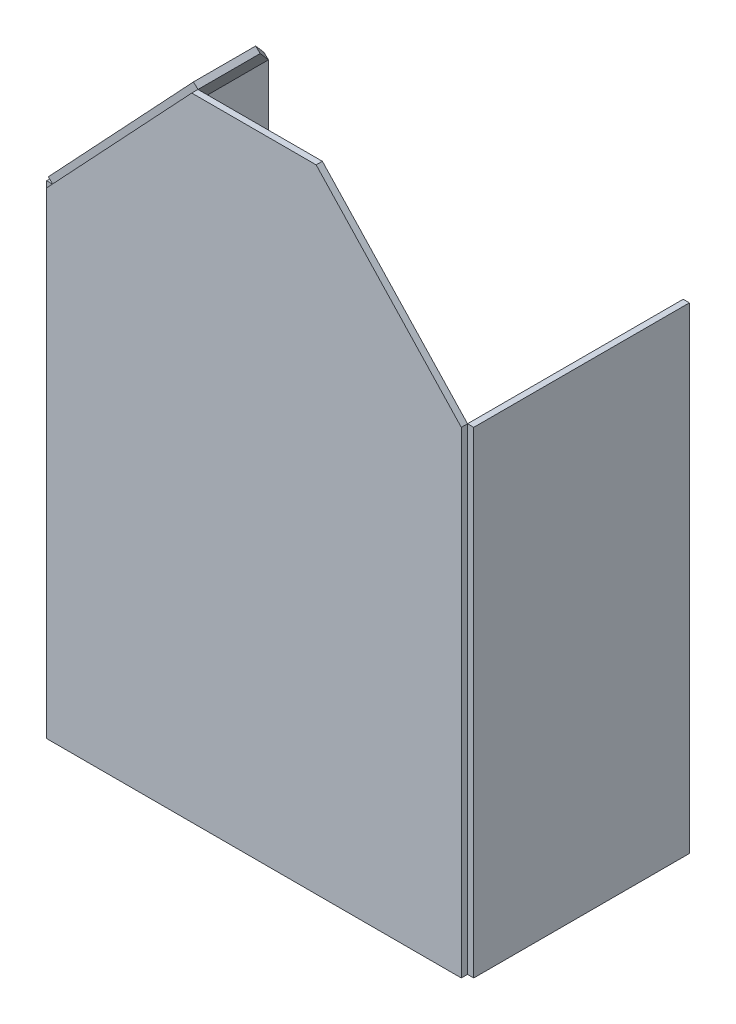
ISO-10303-21;
HEADER;
FILE_DESCRIPTION(('STEP AP214'),'2;1');
FILE_NAME('part.step','',(''),(''),'','','');
FILE_SCHEMA(('AUTOMOTIVE_DESIGN { 1 0 10303 214 1 1 1 1 }'));
ENDSEC;
DATA;
#1=APPLICATION_CONTEXT('core data for automotive mechanical design processes');
#2=APPLICATION_PROTOCOL_DEFINITION('international standard','automotive_design',2000,#1);
#3=PRODUCT_CONTEXT('',#1,'mechanical');
#4=PRODUCT('Part','Part','',(#3));
#5=PRODUCT_RELATED_PRODUCT_CATEGORY('part','',(#4));
#6=PRODUCT_DEFINITION_FORMATION('','',#4);
#7=PRODUCT_DEFINITION_CONTEXT('part definition',#1,'design');
#8=PRODUCT_DEFINITION('design','',#6,#7);
#9=PRODUCT_DEFINITION_SHAPE('','',#8);
#10=(LENGTH_UNIT() NAMED_UNIT(*) SI_UNIT(.MILLI.,.METRE.));
#11=(NAMED_UNIT(*) PLANE_ANGLE_UNIT() SI_UNIT($,.RADIAN.));
#12=(NAMED_UNIT(*) SI_UNIT($,.STERADIAN.) SOLID_ANGLE_UNIT());
#13=UNCERTAINTY_MEASURE_WITH_UNIT(LENGTH_MEASURE(1.E-05),#10,'distance_accuracy_value','');
#14=(GEOMETRIC_REPRESENTATION_CONTEXT(3) GLOBAL_UNCERTAINTY_ASSIGNED_CONTEXT((#13)) GLOBAL_UNIT_ASSIGNED_CONTEXT((#10,
#11,#12)) REPRESENTATION_CONTEXT('',''));
#15=CARTESIAN_POINT('',(0.,0.,0.));
#16=DIRECTION('',(0.,0.,1.));
#17=DIRECTION('',(1.,0.,0.));
#18=AXIS2_PLACEMENT_3D('',#15,#16,#17);
#19=CARTESIAN_POINT('',(-3.,230.,-104.));
#20=DIRECTION('',(0.,0.,-1.));
#21=DIRECTION('',(0.,1.,0.));
#22=AXIS2_PLACEMENT_3D('',#19,#20,#21);
#23=PLANE('',#22);
#24=DIRECTION('',(0.,1.,0.));
#25=VECTOR('',#24,1.);
#26=CARTESIAN_POINT('',(0.,230.,-104.));
#27=LINE('',#26,#25);
#28=CARTESIAN_POINT('',(0.,-0.0864023309644507,-104.));
#29=VERTEX_POINT('',#28);
#30=CARTESIAN_POINT('',(0.,230.,-104.));
#31=VERTEX_POINT('',#30);
#32=EDGE_CURVE('E108',#29,#31,#27,.T.);
#33=ORIENTED_EDGE('',*,*,#32,.F.);
#34=DIRECTION('',(1.,0.,0.));
#35=VECTOR('',#34,1.);
#36=CARTESIAN_POINT('',(-3.,-0.0864023309644507,-104.));
#37=LINE('',#36,#35);
#38=CARTESIAN_POINT('',(-3.,-0.0864023309644507,-104.));
#39=VERTEX_POINT('',#38);
#40=EDGE_CURVE('E12',#39,#29,#37,.T.);
#41=ORIENTED_EDGE('',*,*,#40,.F.);
#42=DIRECTION('',(0.,1.,0.));
#43=VECTOR('',#42,1.);
#44=CARTESIAN_POINT('',(-3.,230.,-104.));
#45=LINE('',#44,#43);
#46=CARTESIAN_POINT('',(-3.,230.,-104.));
#47=VERTEX_POINT('',#46);
#48=EDGE_CURVE('E102',#39,#47,#45,.T.);
#49=ORIENTED_EDGE('',*,*,#48,.T.);
#50=DIRECTION('',(1.,0.,0.));
#51=VECTOR('',#50,1.);
#52=CARTESIAN_POINT('',(-3.,230.,-104.));
#53=LINE('',#52,#51);
#54=EDGE_CURVE('E47',#47,#31,#53,.T.);
#55=ORIENTED_EDGE('',*,*,#54,.T.);
#56=EDGE_LOOP('',(#33,#41,#49,#55));
#57=FACE_BOUND('',#56,.T.);
#58=ADVANCED_FACE('F44',(#57),#23,.T.);
#59=CARTESIAN_POINT('',(-3.,-0.0864023309644507,-104.));
#60=DIRECTION('',(0.,-1.,0.));
#61=DIRECTION('',(0.,0.,-1.));
#62=AXIS2_PLACEMENT_3D('',#59,#60,#61);
#63=PLANE('',#62);
#64=DIRECTION('',(0.,0.,-1.));
#65=VECTOR('',#64,1.);
#66=CARTESIAN_POINT('',(0.,-0.0864023309644507,-104.));
#67=LINE('',#66,#65);
#68=CARTESIAN_POINT('',(0.,-0.0864023309644635,-1.41915123067224E-13));
#69=VERTEX_POINT('',#68);
#70=EDGE_CURVE('E104',#69,#29,#67,.T.);
#71=ORIENTED_EDGE('',*,*,#70,.F.);
#72=DIRECTION('',(1.,0.,0.));
#73=VECTOR('',#72,1.);
#74=CARTESIAN_POINT('',(-3.,-0.0864023309644635,-1.41915123067224E-13));
#75=LINE('',#74,#73);
#76=CARTESIAN_POINT('',(-3.,-0.0864023309644635,-1.41915123067224E-13));
#77=VERTEX_POINT('',#76);
#78=EDGE_CURVE('E53',#77,#69,#75,.T.);
#79=ORIENTED_EDGE('',*,*,#78,.F.);
#80=DIRECTION('',(0.,0.,-1.));
#81=VECTOR('',#80,1.);
#82=CARTESIAN_POINT('',(-3.,-0.0864023309644507,-104.));
#83=LINE('',#82,#81);
#84=EDGE_CURVE('E99',#77,#39,#83,.T.);
#85=ORIENTED_EDGE('',*,*,#84,.T.);
#86=ORIENTED_EDGE('',*,*,#40,.T.);
#87=EDGE_LOOP('',(#71,#79,#85,#86));
#88=FACE_BOUND('',#87,.T.);
#89=ADVANCED_FACE('F118',(#88),#63,.T.);
#90=CARTESIAN_POINT('',(-3.,230.,0.));
#91=DIRECTION('',(0.,0.,1.));
#92=DIRECTION('',(0.,-1.,0.));
#93=AXIS2_PLACEMENT_3D('',#90,#91,#92);
#94=PLANE('',#93);
#95=DIRECTION('',(0.,-1.,0.));
#96=VECTOR('',#95,1.);
#97=CARTESIAN_POINT('',(0.,230.,0.));
#98=LINE('',#97,#96);
#99=CARTESIAN_POINT('',(0.,230.,0.));
#100=VERTEX_POINT('',#99);
#101=EDGE_CURVE('E94',#100,#69,#98,.T.);
#102=ORIENTED_EDGE('',*,*,#101,.F.);
#103=DIRECTION('',(1.,0.,0.));
#104=VECTOR('',#103,1.);
#105=CARTESIAN_POINT('',(-3.,230.,0.));
#106=LINE('',#105,#104);
#107=CARTESIAN_POINT('',(-3.,230.,0.));
#108=VERTEX_POINT('',#107);
#109=EDGE_CURVE('E89',#108,#100,#106,.T.);
#110=ORIENTED_EDGE('',*,*,#109,.F.);
#111=DIRECTION('',(0.,-1.,0.));
#112=VECTOR('',#111,1.);
#113=CARTESIAN_POINT('',(-3.,230.,0.));
#114=LINE('',#113,#112);
#115=EDGE_CURVE('E92',#108,#77,#114,.T.);
#116=ORIENTED_EDGE('',*,*,#115,.T.);
#117=ORIENTED_EDGE('',*,*,#78,.T.);
#118=EDGE_LOOP('',(#102,#110,#116,#117));
#119=FACE_BOUND('',#118,.T.);
#120=ADVANCED_FACE('F91',(#119),#94,.T.);
#121=CARTESIAN_POINT('',(-3.,230.,-104.));
#122=DIRECTION('',(0.,1.,0.));
#123=DIRECTION('',(0.,0.,1.));
#124=AXIS2_PLACEMENT_3D('',#121,#122,#123);
#125=PLANE('',#124);
#126=DIRECTION('',(0.,0.,1.));
#127=VECTOR('',#126,1.);
#128=CARTESIAN_POINT('',(0.,230.,-104.));
#129=LINE('',#128,#127);
#130=EDGE_CURVE('E111',#31,#100,#129,.T.);
#131=ORIENTED_EDGE('',*,*,#130,.F.);
#132=ORIENTED_EDGE('',*,*,#54,.F.);
#133=DIRECTION('',(0.,0.,1.));
#134=VECTOR('',#133,1.);
#135=CARTESIAN_POINT('',(-3.,230.,-104.));
#136=LINE('',#135,#134);
#137=EDGE_CURVE('E98',#47,#108,#136,.T.);
#138=ORIENTED_EDGE('',*,*,#137,.T.);
#139=ORIENTED_EDGE('',*,*,#109,.T.);
#140=EDGE_LOOP('',(#131,#132,#138,#139));
#141=FACE_BOUND('',#140,.T.);
#142=ADVANCED_FACE('F101',(#141),#125,.T.);
#143=CARTESIAN_POINT('',(-3.,0.,0.));
#144=DIRECTION('',(-1.,0.,0.));
#145=DIRECTION('',(0.,0.,1.));
#146=AXIS2_PLACEMENT_3D('',#143,#144,#145);
#147=PLANE('',#146);
#148=ORIENTED_EDGE('',*,*,#48,.F.);
#149=ORIENTED_EDGE('',*,*,#84,.F.);
#150=ORIENTED_EDGE('',*,*,#115,.F.);
#151=ORIENTED_EDGE('',*,*,#137,.F.);
#152=EDGE_LOOP('',(#148,#149,#150,#151));
#153=FACE_BOUND('',#152,.T.);
#154=ADVANCED_FACE('F97',(#153),#147,.T.);
#155=CARTESIAN_POINT('',(0.,0.,0.));
#156=DIRECTION('',(-1.,0.,0.));
#157=DIRECTION('',(0.,0.,1.));
#158=AXIS2_PLACEMENT_3D('',#155,#156,#157);
#159=PLANE('',#158);
#160=ORIENTED_EDGE('',*,*,#32,.T.);
#161=ORIENTED_EDGE('',*,*,#130,.T.);
#162=ORIENTED_EDGE('',*,*,#101,.T.);
#163=ORIENTED_EDGE('',*,*,#70,.T.);
#164=EDGE_LOOP('',(#160,#161,#162,#163));
#165=FACE_BOUND('',#164,.T.);
#166=ADVANCED_FACE('F117',(#165),#159,.F.);
#167=CLOSED_SHELL('',(#58,#89,#120,#142,#154,#166));
#168=MANIFOLD_SOLID_BREP('B2',#167);
#169=CARTESIAN_POINT('',(203.,230.,0.));
#170=DIRECTION('',(0.,-1.,0.));
#171=DIRECTION('',(0.,0.,-1.));
#172=AXIS2_PLACEMENT_3D('',#169,#170,#171);
#173=PLANE('',#172);
#174=DIRECTION('',(0.,0.,1.));
#175=VECTOR('',#174,1.);
#176=CARTESIAN_POINT('',(200.,230.,0.));
#177=LINE('',#176,#175);
#178=CARTESIAN_POINT('',(200.,230.,-104.));
#179=VERTEX_POINT('',#178);
#180=CARTESIAN_POINT('',(200.,230.,0.));
#181=VERTEX_POINT('',#180);
#182=EDGE_CURVE('E241',#179,#181,#177,.T.);
#183=ORIENTED_EDGE('',*,*,#182,.T.);
#184=DIRECTION('',(-1.,0.,0.));
#185=VECTOR('',#184,1.);
#186=CARTESIAN_POINT('',(203.,230.,0.));
#187=LINE('',#186,#185);
#188=CARTESIAN_POINT('',(203.,230.,0.));
#189=VERTEX_POINT('',#188);
#190=EDGE_CURVE('E42',#189,#181,#187,.T.);
#191=ORIENTED_EDGE('',*,*,#190,.F.);
#192=DIRECTION('',(0.,0.,1.));
#193=VECTOR('',#192,1.);
#194=CARTESIAN_POINT('',(203.,230.,0.));
#195=LINE('',#194,#193);
#196=CARTESIAN_POINT('',(203.,230.,-104.));
#197=VERTEX_POINT('',#196);
#198=EDGE_CURVE('E229',#197,#189,#195,.T.);
#199=ORIENTED_EDGE('',*,*,#198,.F.);
#200=DIRECTION('',(-1.,0.,0.));
#201=VECTOR('',#200,1.);
#202=CARTESIAN_POINT('',(203.,230.,-104.));
#203=LINE('',#202,#201);
#204=EDGE_CURVE('E237',#197,#179,#203,.T.);
#205=ORIENTED_EDGE('',*,*,#204,.T.);
#206=EDGE_LOOP('',(#183,#191,#199,#205));
#207=FACE_BOUND('',#206,.T.);
#208=ADVANCED_FACE('F178',(#207),#173,.F.);
#209=CARTESIAN_POINT('',(203.,230.,0.));
#210=DIRECTION('',(0.,0.,-1.));
#211=DIRECTION('',(-1.,0.,0.));
#212=AXIS2_PLACEMENT_3D('',#209,#210,#211);
#213=PLANE('',#212);
#214=DIRECTION('',(0.,-1.,0.));
#215=VECTOR('',#214,1.);
#216=CARTESIAN_POINT('',(200.,230.,0.));
#217=LINE('',#216,#215);
#218=CARTESIAN_POINT('',(200.,0.,0.));
#219=VERTEX_POINT('',#218);
#220=EDGE_CURVE('E233',#181,#219,#217,.T.);
#221=ORIENTED_EDGE('',*,*,#220,.T.);
#222=DIRECTION('',(-1.,0.,0.));
#223=VECTOR('',#222,1.);
#224=CARTESIAN_POINT('',(203.,0.,0.));
#225=LINE('',#224,#223);
#226=CARTESIAN_POINT('',(203.,0.,0.));
#227=VERTEX_POINT('',#226);
#228=EDGE_CURVE('E186',#227,#219,#225,.T.);
#229=ORIENTED_EDGE('',*,*,#228,.F.);
#230=DIRECTION('',(0.,-1.,0.));
#231=VECTOR('',#230,1.);
#232=CARTESIAN_POINT('',(203.,230.,0.));
#233=LINE('',#232,#231);
#234=EDGE_CURVE('E224',#189,#227,#233,.T.);
#235=ORIENTED_EDGE('',*,*,#234,.F.);
#236=ORIENTED_EDGE('',*,*,#190,.T.);
#237=EDGE_LOOP('',(#221,#229,#235,#236));
#238=FACE_BOUND('',#237,.T.);
#239=ADVANCED_FACE('F232',(#238),#213,.F.);
#240=CARTESIAN_POINT('',(203.,0.,0.));
#241=DIRECTION('',(0.,1.,0.));
#242=DIRECTION('',(0.,0.,1.));
#243=AXIS2_PLACEMENT_3D('',#240,#241,#242);
#244=PLANE('',#243);
#245=DIRECTION('',(0.,0.,-1.));
#246=VECTOR('',#245,1.);
#247=CARTESIAN_POINT('',(200.,0.,0.));
#248=LINE('',#247,#246);
#249=CARTESIAN_POINT('',(200.,0.,-104.));
#250=VERTEX_POINT('',#249);
#251=EDGE_CURVE('E211',#219,#250,#248,.T.);
#252=ORIENTED_EDGE('',*,*,#251,.T.);
#253=DIRECTION('',(-1.,0.,0.));
#254=VECTOR('',#253,1.);
#255=CARTESIAN_POINT('',(203.,0.,-104.));
#256=LINE('',#255,#254);
#257=CARTESIAN_POINT('',(203.,0.,-104.));
#258=VERTEX_POINT('',#257);
#259=EDGE_CURVE('E234',#258,#250,#256,.T.);
#260=ORIENTED_EDGE('',*,*,#259,.F.);
#261=DIRECTION('',(0.,0.,-1.));
#262=VECTOR('',#261,1.);
#263=CARTESIAN_POINT('',(203.,0.,0.));
#264=LINE('',#263,#262);
#265=EDGE_CURVE('E227',#227,#258,#264,.T.);
#266=ORIENTED_EDGE('',*,*,#265,.F.);
#267=ORIENTED_EDGE('',*,*,#228,.T.);
#268=EDGE_LOOP('',(#252,#260,#266,#267));
#269=FACE_BOUND('',#268,.T.);
#270=ADVANCED_FACE('F235',(#269),#244,.F.);
#271=CARTESIAN_POINT('',(203.,230.,-104.));
#272=DIRECTION('',(0.,0.,1.));
#273=DIRECTION('',(0.,-1.,0.));
#274=AXIS2_PLACEMENT_3D('',#271,#272,#273);
#275=PLANE('',#274);
#276=DIRECTION('',(0.,1.,0.));
#277=VECTOR('',#276,1.);
#278=CARTESIAN_POINT('',(200.,230.,-104.));
#279=LINE('',#278,#277);
#280=EDGE_CURVE('E217',#250,#179,#279,.T.);
#281=ORIENTED_EDGE('',*,*,#280,.T.);
#282=ORIENTED_EDGE('',*,*,#204,.F.);
#283=DIRECTION('',(0.,1.,0.));
#284=VECTOR('',#283,1.);
#285=CARTESIAN_POINT('',(203.,230.,-104.));
#286=LINE('',#285,#284);
#287=EDGE_CURVE('E194',#258,#197,#286,.T.);
#288=ORIENTED_EDGE('',*,*,#287,.F.);
#289=ORIENTED_EDGE('',*,*,#259,.T.);
#290=EDGE_LOOP('',(#281,#282,#288,#289));
#291=FACE_BOUND('',#290,.T.);
#292=ADVANCED_FACE('F248',(#291),#275,.F.);
#293=CARTESIAN_POINT('',(203.,0.,0.));
#294=DIRECTION('',(-1.,0.,0.));
#295=DIRECTION('',(0.,0.,1.));
#296=AXIS2_PLACEMENT_3D('',#293,#294,#295);
#297=PLANE('',#296);
#298=ORIENTED_EDGE('',*,*,#198,.T.);
#299=ORIENTED_EDGE('',*,*,#234,.T.);
#300=ORIENTED_EDGE('',*,*,#265,.T.);
#301=ORIENTED_EDGE('',*,*,#287,.T.);
#302=EDGE_LOOP('',(#298,#299,#300,#301));
#303=FACE_BOUND('',#302,.T.);
#304=ADVANCED_FACE('F225',(#303),#297,.F.);
#305=CARTESIAN_POINT('',(200.,0.,0.));
#306=DIRECTION('',(-1.,0.,0.));
#307=DIRECTION('',(0.,0.,1.));
#308=AXIS2_PLACEMENT_3D('',#305,#306,#307);
#309=PLANE('',#308);
#310=ORIENTED_EDGE('',*,*,#182,.F.);
#311=ORIENTED_EDGE('',*,*,#280,.F.);
#312=ORIENTED_EDGE('',*,*,#251,.F.);
#313=ORIENTED_EDGE('',*,*,#220,.F.);
#314=EDGE_LOOP('',(#310,#311,#312,#313));
#315=FACE_BOUND('',#314,.T.);
#316=ADVANCED_FACE('F251',(#315),#309,.T.);
#317=CLOSED_SHELL('',(#208,#239,#270,#292,#304,#316));
#318=MANIFOLD_SOLID_BREP('B6',#317);
#319=CARTESIAN_POINT('',(67.8119700940155,306.676704339192,0.));
#320=DIRECTION('',(0.,0.,-1.));
#321=DIRECTION('',(-1.,0.,0.));
#322=AXIS2_PLACEMENT_3D('',#319,#320,#321);
#323=PLANE('',#322);
#324=DIRECTION('',(0.684147899094425,0.729343301994805,0.));
#325=VECTOR('',#324,1.);
#326=CARTESIAN_POINT('',(69.9999999999999,304.624260641908,0.));
#327=LINE('',#326,#325);
#328=CARTESIAN_POINT('',(0.,230.,0.));
#329=VERTEX_POINT('',#328);
#330=CARTESIAN_POINT('',(69.9999999999999,304.624260641908,0.));
#331=VERTEX_POINT('',#330);
#332=EDGE_CURVE('E374',#329,#331,#327,.T.);
#333=ORIENTED_EDGE('',*,*,#332,.T.);
#334=DIRECTION('',(0.729343301994805,-0.684147899094424,0.));
#335=VECTOR('',#334,1.);
#336=CARTESIAN_POINT('',(67.8119700940155,306.676704339192,0.));
#337=LINE('',#336,#335);
#338=CARTESIAN_POINT('',(67.8119700940155,306.676704339192,0.));
#339=VERTEX_POINT('',#338);
#340=EDGE_CURVE('E176',#339,#331,#337,.T.);
#341=ORIENTED_EDGE('',*,*,#340,.F.);
#342=DIRECTION('',(0.684147899094425,0.729343301994805,0.));
#343=VECTOR('',#342,1.);
#344=CARTESIAN_POINT('',(67.8119700940155,306.676704339192,0.));
#345=LINE('',#344,#343);
#346=CARTESIAN_POINT('',(-2.1880299059845,232.052443697283,0.));
#347=VERTEX_POINT('',#346);
#348=EDGE_CURVE('E362',#347,#339,#345,.T.);
#349=ORIENTED_EDGE('',*,*,#348,.F.);
#350=DIRECTION('',(0.729343301994805,-0.684147899094424,0.));
#351=VECTOR('',#350,1.);
#352=CARTESIAN_POINT('',(-2.1880299059845,232.052443697283,0.));
#353=LINE('',#352,#351);
#354=EDGE_CURVE('E370',#347,#329,#353,.T.);
#355=ORIENTED_EDGE('',*,*,#354,.T.);
#356=EDGE_LOOP('',(#333,#341,#349,#355));
#357=FACE_BOUND('',#356,.T.);
#358=ADVANCED_FACE('F311',(#357),#323,.F.);
#359=CARTESIAN_POINT('',(67.8119700940155,306.676704339192,-30.));
#360=DIRECTION('',(-0.684147899094425,-0.729343301994805,0.));
#361=DIRECTION('',(0.729343301994805,-0.684147899094425,0.));
#362=AXIS2_PLACEMENT_3D('',#359,#360,#361);
#363=PLANE('',#362);
#364=DIRECTION('',(0.,0.,-1.));
#365=VECTOR('',#364,1.);
#366=CARTESIAN_POINT('',(69.9999999999999,304.624260641908,-30.));
#367=LINE('',#366,#365);
#368=CARTESIAN_POINT('',(69.9999999999999,304.624260641908,-30.));
#369=VERTEX_POINT('',#368);
#370=EDGE_CURVE('E366',#331,#369,#367,.T.);
#371=ORIENTED_EDGE('',*,*,#370,.T.);
#372=DIRECTION('',(0.729343301994805,-0.684147899094424,0.));
#373=VECTOR('',#372,1.);
#374=CARTESIAN_POINT('',(67.8119700940155,306.676704339192,-30.));
#375=LINE('',#374,#373);
#376=CARTESIAN_POINT('',(67.8119700940155,306.676704339192,-30.));
#377=VERTEX_POINT('',#376);
#378=EDGE_CURVE('E319',#377,#369,#375,.T.);
#379=ORIENTED_EDGE('',*,*,#378,.F.);
#380=DIRECTION('',(0.,0.,-1.));
#381=VECTOR('',#380,1.);
#382=CARTESIAN_POINT('',(67.8119700940155,306.676704339192,-30.));
#383=LINE('',#382,#381);
#384=EDGE_CURVE('E357',#339,#377,#383,.T.);
#385=ORIENTED_EDGE('',*,*,#384,.F.);
#386=ORIENTED_EDGE('',*,*,#340,.T.);
#387=EDGE_LOOP('',(#371,#379,#385,#386));
#388=FACE_BOUND('',#387,.T.);
#389=ADVANCED_FACE('F365',(#388),#363,.F.);
#390=CARTESIAN_POINT('',(-2.1880299059845,232.052443697283,-104.));
#391=DIRECTION('',(-0.400933594792874,-0.427419615398867,0.810286816466088));
#392=DIRECTION('',(0.,-0.884489160823003,-0.466560740297145));
#393=AXIS2_PLACEMENT_3D('',#390,#391,#392);
#394=PLANE('',#393);
#395=DIRECTION('',(-0.554356023149184,-0.590977262284235,-0.58603351018628));
#396=VECTOR('',#395,1.);
#397=CARTESIAN_POINT('',(0.,230.,-104.));
#398=LINE('',#397,#396);
#399=CARTESIAN_POINT('',(0.,230.,-104.));
#400=VERTEX_POINT('',#399);
#401=EDGE_CURVE('E344',#369,#400,#398,.T.);
#402=ORIENTED_EDGE('',*,*,#401,.T.);
#403=DIRECTION('',(0.729343301994805,-0.684147899094424,0.));
#404=VECTOR('',#403,1.);
#405=CARTESIAN_POINT('',(-2.1880299059845,232.052443697283,-104.));
#406=LINE('',#405,#404);
#407=CARTESIAN_POINT('',(-2.1880299059845,232.052443697283,-104.));
#408=VERTEX_POINT('',#407);
#409=EDGE_CURVE('E367',#408,#400,#406,.T.);
#410=ORIENTED_EDGE('',*,*,#409,.F.);
#411=DIRECTION('',(-0.554356023149184,-0.590977262284235,-0.58603351018628));
#412=VECTOR('',#411,1.);
#413=CARTESIAN_POINT('',(-2.1880299059845,232.052443697283,-104.));
#414=LINE('',#413,#412);
#415=EDGE_CURVE('E360',#377,#408,#414,.T.);
#416=ORIENTED_EDGE('',*,*,#415,.F.);
#417=ORIENTED_EDGE('',*,*,#378,.T.);
#418=EDGE_LOOP('',(#402,#410,#416,#417));
#419=FACE_BOUND('',#418,.T.);
#420=ADVANCED_FACE('F368',(#419),#394,.F.);
#421=CARTESIAN_POINT('',(-2.1880299059845,232.052443697283,0.));
#422=DIRECTION('',(0.684147899094425,0.729343301994805,0.));
#423=DIRECTION('',(-0.729343301994805,0.684147899094425,0.));
#424=AXIS2_PLACEMENT_3D('',#421,#422,#423);
#425=PLANE('',#424);
#426=DIRECTION('',(0.,0.,1.));
#427=VECTOR('',#426,1.);
#428=CARTESIAN_POINT('',(0.,230.,0.));
#429=LINE('',#428,#427);
#430=EDGE_CURVE('E350',#400,#329,#429,.T.);
#431=ORIENTED_EDGE('',*,*,#430,.T.);
#432=ORIENTED_EDGE('',*,*,#354,.F.);
#433=DIRECTION('',(0.,0.,1.));
#434=VECTOR('',#433,1.);
#435=CARTESIAN_POINT('',(-2.1880299059845,232.052443697283,0.));
#436=LINE('',#435,#434);
#437=EDGE_CURVE('E327',#408,#347,#436,.T.);
#438=ORIENTED_EDGE('',*,*,#437,.F.);
#439=ORIENTED_EDGE('',*,*,#409,.T.);
#440=EDGE_LOOP('',(#431,#432,#438,#439));
#441=FACE_BOUND('',#440,.T.);
#442=ADVANCED_FACE('F381',(#441),#425,.F.);
#443=CARTESIAN_POINT('',(-116.953128095002,109.705863699406,0.));
#444=DIRECTION('',(0.729343301994805,-0.684147899094425,0.));
#445=DIRECTION('',(0.684147899094425,0.729343301994805,0.));
#446=AXIS2_PLACEMENT_3D('',#443,#444,#445);
#447=PLANE('',#446);
#448=ORIENTED_EDGE('',*,*,#348,.T.);
#449=ORIENTED_EDGE('',*,*,#384,.T.);
#450=ORIENTED_EDGE('',*,*,#415,.T.);
#451=ORIENTED_EDGE('',*,*,#437,.T.);
#452=EDGE_LOOP('',(#448,#449,#450,#451));
#453=FACE_BOUND('',#452,.T.);
#454=ADVANCED_FACE('F358',(#453),#447,.F.);
#455=CARTESIAN_POINT('',(-114.765098189017,107.653420002122,0.));
#456=DIRECTION('',(0.729343301994805,-0.684147899094425,0.));
#457=DIRECTION('',(0.684147899094425,0.729343301994805,0.));
#458=AXIS2_PLACEMENT_3D('',#455,#456,#457);
#459=PLANE('',#458);
#460=ORIENTED_EDGE('',*,*,#332,.F.);
#461=ORIENTED_EDGE('',*,*,#430,.F.);
#462=ORIENTED_EDGE('',*,*,#401,.F.);
#463=ORIENTED_EDGE('',*,*,#370,.F.);
#464=EDGE_LOOP('',(#460,#461,#462,#463));
#465=FACE_BOUND('',#464,.T.);
#466=ADVANCED_FACE('F384',(#465),#459,.T.);
#467=CLOSED_SHELL('',(#358,#389,#420,#442,#454,#466));
#468=MANIFOLD_SOLID_BREP('B36',#467);
#469=CARTESIAN_POINT('',(0.,230.,3.));
#470=DIRECTION('',(1.,0.,0.));
#471=DIRECTION('',(0.,1.,0.));
#472=AXIS2_PLACEMENT_3D('',#469,#470,#471);
#473=PLANE('',#472);
#474=DIRECTION('',(0.,-1.,0.));
#475=VECTOR('',#474,1.);
#476=CARTESIAN_POINT('',(0.,230.,0.));
#477=LINE('',#476,#475);
#478=CARTESIAN_POINT('',(0.,230.,0.));
#479=VERTEX_POINT('',#478);
#480=CARTESIAN_POINT('',(0.,0.,0.));
#481=VERTEX_POINT('',#480);
#482=EDGE_CURVE('E519',#479,#481,#477,.T.);
#483=ORIENTED_EDGE('',*,*,#482,.T.);
#484=DIRECTION('',(0.,0.,-1.));
#485=VECTOR('',#484,1.);
#486=CARTESIAN_POINT('',(0.,0.,3.));
#487=LINE('',#486,#485);
#488=CARTESIAN_POINT('',(0.,0.,3.));
#489=VERTEX_POINT('',#488);
#490=EDGE_CURVE('E309',#489,#481,#487,.T.);
#491=ORIENTED_EDGE('',*,*,#490,.F.);
#492=DIRECTION('',(0.,-1.,0.));
#493=VECTOR('',#492,1.);
#494=CARTESIAN_POINT('',(0.,230.,3.));
#495=LINE('',#494,#493);
#496=CARTESIAN_POINT('',(0.,230.,3.));
#497=VERTEX_POINT('',#496);
#498=EDGE_CURVE('E529',#497,#489,#495,.T.);
#499=ORIENTED_EDGE('',*,*,#498,.F.);
#500=DIRECTION('',(0.,0.,-1.));
#501=VECTOR('',#500,1.);
#502=CARTESIAN_POINT('',(0.,230.,3.));
#503=LINE('',#502,#501);
#504=EDGE_CURVE('E515',#497,#479,#503,.T.);
#505=ORIENTED_EDGE('',*,*,#504,.T.);
#506=EDGE_LOOP('',(#483,#491,#499,#505));
#507=FACE_BOUND('',#506,.T.);
#508=ADVANCED_FACE('F435',(#507),#473,.F.);
#509=CARTESIAN_POINT('',(0.,0.,3.));
#510=DIRECTION('',(0.,1.,0.));
#511=DIRECTION('',(0.,0.,1.));
#512=AXIS2_PLACEMENT_3D('',#509,#510,#511);
#513=PLANE('',#512);
#514=DIRECTION('',(1.,0.,0.));
#515=VECTOR('',#514,1.);
#516=CARTESIAN_POINT('',(0.,0.,0.));
#517=LINE('',#516,#515);
#518=CARTESIAN_POINT('',(200.,0.,0.));
#519=VERTEX_POINT('',#518);
#520=EDGE_CURVE('E522',#481,#519,#517,.T.);
#521=ORIENTED_EDGE('',*,*,#520,.T.);
#522=DIRECTION('',(0.,0.,-1.));
#523=VECTOR('',#522,1.);
#524=CARTESIAN_POINT('',(200.,0.,3.));
#525=LINE('',#524,#523);
#526=CARTESIAN_POINT('',(200.,0.,3.));
#527=VERTEX_POINT('',#526);
#528=EDGE_CURVE('E443',#527,#519,#525,.T.);
#529=ORIENTED_EDGE('',*,*,#528,.F.);
#530=DIRECTION('',(1.,0.,0.));
#531=VECTOR('',#530,1.);
#532=CARTESIAN_POINT('',(0.,0.,3.));
#533=LINE('',#532,#531);
#534=EDGE_CURVE('E488',#489,#527,#533,.T.);
#535=ORIENTED_EDGE('',*,*,#534,.F.);
#536=ORIENTED_EDGE('',*,*,#490,.T.);
#537=EDGE_LOOP('',(#521,#529,#535,#536));
#538=FACE_BOUND('',#537,.T.);
#539=ADVANCED_FACE('F553',(#538),#513,.F.);
#540=CARTESIAN_POINT('',(200.,0.,3.));
#541=DIRECTION('',(-1.,0.,0.));
#542=DIRECTION('',(0.,0.,1.));
#543=AXIS2_PLACEMENT_3D('',#540,#541,#542);
#544=PLANE('',#543);
#545=DIRECTION('',(0.,1.,0.));
#546=VECTOR('',#545,1.);
#547=CARTESIAN_POINT('',(200.,0.,0.));
#548=LINE('',#547,#546);
#549=CARTESIAN_POINT('',(200.,230.,0.));
#550=VERTEX_POINT('',#549);
#551=EDGE_CURVE('E524',#519,#550,#548,.T.);
#552=ORIENTED_EDGE('',*,*,#551,.T.);
#553=DIRECTION('',(0.,0.,-1.));
#554=VECTOR('',#553,1.);
#555=CARTESIAN_POINT('',(200.,230.,3.));
#556=LINE('',#555,#554);
#557=CARTESIAN_POINT('',(200.,230.,3.));
#558=VERTEX_POINT('',#557);
#559=EDGE_CURVE('E510',#558,#550,#556,.T.);
#560=ORIENTED_EDGE('',*,*,#559,.F.);
#561=DIRECTION('',(0.,1.,0.));
#562=VECTOR('',#561,1.);
#563=CARTESIAN_POINT('',(200.,0.,3.));
#564=LINE('',#563,#562);
#565=EDGE_CURVE('E501',#527,#558,#564,.T.);
#566=ORIENTED_EDGE('',*,*,#565,.F.);
#567=ORIENTED_EDGE('',*,*,#528,.T.);
#568=EDGE_LOOP('',(#552,#560,#566,#567));
#569=FACE_BOUND('',#568,.T.);
#570=ADVANCED_FACE('F535',(#569),#544,.F.);
#571=CARTESIAN_POINT('',(200.,230.,3.));
#572=DIRECTION('',(-0.729343301994805,-0.684147899094425,0.));
#573=DIRECTION('',(0.684147899094425,-0.729343301994805,0.));
#574=AXIS2_PLACEMENT_3D('',#571,#572,#573);
#575=PLANE('',#574);
#576=DIRECTION('',(-0.684147899094425,0.729343301994805,0.));
#577=VECTOR('',#576,1.);
#578=CARTESIAN_POINT('',(200.,230.,0.));
#579=LINE('',#578,#577);
#580=CARTESIAN_POINT('',(130.,304.624260641908,0.));
#581=VERTEX_POINT('',#580);
#582=EDGE_CURVE('E509',#550,#581,#579,.T.);
#583=ORIENTED_EDGE('',*,*,#582,.T.);
#584=DIRECTION('',(0.,0.,-1.));
#585=VECTOR('',#584,1.);
#586=CARTESIAN_POINT('',(130.,304.624260641908,3.));
#587=LINE('',#586,#585);
#588=CARTESIAN_POINT('',(130.,304.624260641908,3.));
#589=VERTEX_POINT('',#588);
#590=EDGE_CURVE('E506',#589,#581,#587,.T.);
#591=ORIENTED_EDGE('',*,*,#590,.F.);
#592=DIRECTION('',(-0.684147899094425,0.729343301994805,0.));
#593=VECTOR('',#592,1.);
#594=CARTESIAN_POINT('',(200.,230.,3.));
#595=LINE('',#594,#593);
#596=EDGE_CURVE('E495',#558,#589,#595,.T.);
#597=ORIENTED_EDGE('',*,*,#596,.F.);
#598=ORIENTED_EDGE('',*,*,#559,.T.);
#599=EDGE_LOOP('',(#583,#591,#597,#598));
#600=FACE_BOUND('',#599,.T.);
#601=ADVANCED_FACE('F507',(#600),#575,.F.);
#602=CARTESIAN_POINT('',(130.,304.624260641908,3.));
#603=DIRECTION('',(0.,-1.,0.));
#604=DIRECTION('',(0.,0.,-1.));
#605=AXIS2_PLACEMENT_3D('',#602,#603,#604);
#606=PLANE('',#605);
#607=DIRECTION('',(-1.,0.,0.));
#608=VECTOR('',#607,1.);
#609=CARTESIAN_POINT('',(130.,304.624260641908,0.));
#610=LINE('',#609,#608);
#611=CARTESIAN_POINT('',(70.,304.624260641908,0.));
#612=VERTEX_POINT('',#611);
#613=EDGE_CURVE('E474',#581,#612,#610,.T.);
#614=ORIENTED_EDGE('',*,*,#613,.T.);
#615=DIRECTION('',(0.,0.,-1.));
#616=VECTOR('',#615,1.);
#617=CARTESIAN_POINT('',(70.,304.624260641908,3.));
#618=LINE('',#617,#616);
#619=CARTESIAN_POINT('',(70.,304.624260641908,3.));
#620=VERTEX_POINT('',#619);
#621=EDGE_CURVE('E511',#620,#612,#618,.T.);
#622=ORIENTED_EDGE('',*,*,#621,.F.);
#623=DIRECTION('',(-1.,0.,0.));
#624=VECTOR('',#623,1.);
#625=CARTESIAN_POINT('',(130.,304.624260641908,3.));
#626=LINE('',#625,#624);
#627=EDGE_CURVE('E499',#589,#620,#626,.T.);
#628=ORIENTED_EDGE('',*,*,#627,.F.);
#629=ORIENTED_EDGE('',*,*,#590,.T.);
#630=EDGE_LOOP('',(#614,#622,#628,#629));
#631=FACE_BOUND('',#630,.T.);
#632=ADVANCED_FACE('F513',(#631),#606,.F.);
#633=CARTESIAN_POINT('',(70.,304.624260641908,3.));
#634=DIRECTION('',(0.729343301994805,-0.684147899094425,0.));
#635=DIRECTION('',(0.684147899094425,0.729343301994805,0.));
#636=AXIS2_PLACEMENT_3D('',#633,#634,#635);
#637=PLANE('',#636);
#638=DIRECTION('',(-0.684147899094425,-0.729343301994805,0.));
#639=VECTOR('',#638,1.);
#640=CARTESIAN_POINT('',(70.,304.624260641908,0.));
#641=LINE('',#640,#639);
#642=EDGE_CURVE('E480',#612,#479,#641,.T.);
#643=ORIENTED_EDGE('',*,*,#642,.T.);
#644=ORIENTED_EDGE('',*,*,#504,.F.);
#645=DIRECTION('',(-0.684147899094425,-0.729343301994805,0.));
#646=VECTOR('',#645,1.);
#647=CARTESIAN_POINT('',(70.,304.624260641908,3.));
#648=LINE('',#647,#646);
#649=EDGE_CURVE('E451',#620,#497,#648,.T.);
#650=ORIENTED_EDGE('',*,*,#649,.F.);
#651=ORIENTED_EDGE('',*,*,#621,.T.);
#652=EDGE_LOOP('',(#643,#644,#650,#651));
#653=FACE_BOUND('',#652,.T.);
#654=ADVANCED_FACE('F542',(#653),#637,.F.);
#655=CARTESIAN_POINT('',(0.,0.,3.));
#656=DIRECTION('',(0.,0.,1.));
#657=DIRECTION('',(1.,0.,0.));
#658=AXIS2_PLACEMENT_3D('',#655,#656,#657);
#659=PLANE('',#658);
#660=ORIENTED_EDGE('',*,*,#498,.T.);
#661=ORIENTED_EDGE('',*,*,#534,.T.);
#662=ORIENTED_EDGE('',*,*,#565,.T.);
#663=ORIENTED_EDGE('',*,*,#596,.T.);
#664=ORIENTED_EDGE('',*,*,#627,.T.);
#665=ORIENTED_EDGE('',*,*,#649,.T.);
#666=EDGE_LOOP('',(#660,#661,#662,#663,#664,#665));
#667=FACE_BOUND('',#666,.T.);
#668=ADVANCED_FACE('F497',(#667),#659,.T.);
#669=CARTESIAN_POINT('',(0.,0.,0.));
#670=DIRECTION('',(0.,0.,1.));
#671=DIRECTION('',(1.,0.,0.));
#672=AXIS2_PLACEMENT_3D('',#669,#670,#671);
#673=PLANE('',#672);
#674=ORIENTED_EDGE('',*,*,#482,.F.);
#675=ORIENTED_EDGE('',*,*,#642,.F.);
#676=ORIENTED_EDGE('',*,*,#613,.F.);
#677=ORIENTED_EDGE('',*,*,#582,.F.);
#678=ORIENTED_EDGE('',*,*,#551,.F.);
#679=ORIENTED_EDGE('',*,*,#520,.F.);
#680=EDGE_LOOP('',(#674,#675,#676,#677,#678,#679));
#681=FACE_BOUND('',#680,.T.);
#682=ADVANCED_FACE('F538',(#681),#673,.F.);
#683=CLOSED_SHELL('',(#508,#539,#570,#601,#632,#654,#668,#682));
#684=MANIFOLD_SOLID_BREP('B170',#683);
#685=ADVANCED_BREP_SHAPE_REPRESENTATION('',(#18,#168,#318,#468,#684),#14);
#686=SHAPE_DEFINITION_REPRESENTATION(#9,#685);
ENDSEC;
END-ISO-10303-21;
